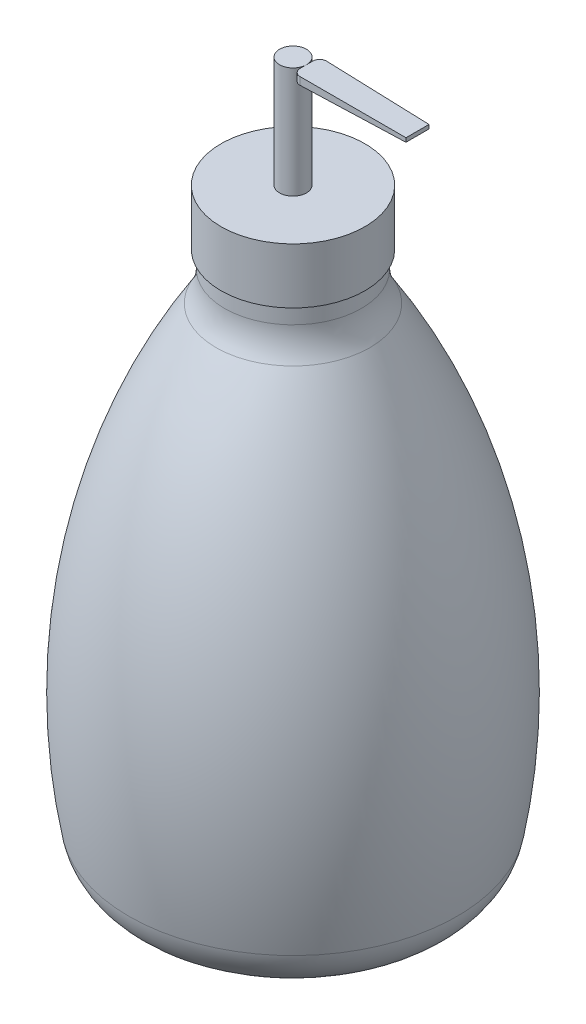
ISO-10303-21;
HEADER;
FILE_DESCRIPTION(('STEP AP214'),'2;1');
FILE_NAME('part.step','',(''),(''),'','','');
FILE_SCHEMA(('AUTOMOTIVE_DESIGN { 1 0 10303 214 1 1 1 1 }'));
ENDSEC;
DATA;
#1=APPLICATION_CONTEXT('core data for automotive mechanical design processes');
#2=APPLICATION_PROTOCOL_DEFINITION('international standard','automotive_design',2000,#1);
#3=PRODUCT_CONTEXT('',#1,'mechanical');
#4=PRODUCT('Part','Part','',(#3));
#5=PRODUCT_RELATED_PRODUCT_CATEGORY('part','',(#4));
#6=PRODUCT_DEFINITION_FORMATION('','',#4);
#7=PRODUCT_DEFINITION_CONTEXT('part definition',#1,'design');
#8=PRODUCT_DEFINITION('design','',#6,#7);
#9=PRODUCT_DEFINITION_SHAPE('','',#8);
#10=(LENGTH_UNIT() NAMED_UNIT(*) SI_UNIT(.MILLI.,.METRE.));
#11=(NAMED_UNIT(*) PLANE_ANGLE_UNIT() SI_UNIT($,.RADIAN.));
#12=(NAMED_UNIT(*) SI_UNIT($,.STERADIAN.) SOLID_ANGLE_UNIT());
#13=UNCERTAINTY_MEASURE_WITH_UNIT(LENGTH_MEASURE(1.E-05),#10,'distance_accuracy_value','');
#14=(GEOMETRIC_REPRESENTATION_CONTEXT(3) GLOBAL_UNCERTAINTY_ASSIGNED_CONTEXT((#13)) GLOBAL_UNIT_ASSIGNED_CONTEXT((#10,
#11,#12)) REPRESENTATION_CONTEXT('',''));
#15=CARTESIAN_POINT('',(0.,0.,0.));
#16=DIRECTION('',(0.,0.,1.));
#17=DIRECTION('',(1.,0.,0.));
#18=AXIS2_PLACEMENT_3D('',#15,#16,#17);
#19=CARTESIAN_POINT('',(2.46084864077986,86.0805582922824,2.46084864077986));
#20=DIRECTION('',(0.0174524064372835,0.,0.999847695156391));
#21=DIRECTION('',(0.999847695156391,0.,-0.0174524064372836));
#22=AXIS2_PLACEMENT_3D('',#19,#20,#21);
#23=PLANE('',#22);
#24=DIRECTION('',(-0.999695459881888,0.0174497491606827,0.0174497491606827));
#25=VECTOR('',#24,1.);
#26=CARTESIAN_POINT('',(2.46084864077986,86.0805582922824,2.46084864077986));
#27=LINE('',#26,#25);
#28=CARTESIAN_POINT('',(22.7808486407799,85.725871372941,2.10616172143848));
#29=VERTEX_POINT('',#28);
#30=CARTESIAN_POINT('',(3.75301319695521,86.0580034760564,2.43829382455388));
#31=VERTEX_POINT('',#30);
#32=EDGE_CURVE('E136',#29,#31,#27,.T.);
#33=ORIENTED_EDGE('',*,*,#32,.T.);
#34=DIRECTION('',(0.,-1.,0.));
#35=VECTOR('',#34,1.);
#36=CARTESIAN_POINT('',(3.75301319695521,86.0805582922824,2.43829382455388));
#37=LINE('',#36,#35);
#38=CARTESIAN_POINT('',(3.75301319695521,84.6696566749118,2.43829382455388));
#39=VERTEX_POINT('',#38);
#40=EDGE_CURVE('E12',#31,#39,#37,.T.);
#41=ORIENTED_EDGE('',*,*,#40,.T.);
#42=DIRECTION('',(-0.999695459881888,-0.0174497491606827,0.0174497491606827));
#43=VECTOR('',#42,1.);
#44=CARTESIAN_POINT('',(2.46084864077986,84.6471018586858,2.46084864077986));
#45=LINE('',#44,#43);
#46=CARTESIAN_POINT('',(22.7808486407799,85.0017887780272,2.10616172143848));
#47=VERTEX_POINT('',#46);
#48=EDGE_CURVE('E109',#47,#39,#45,.T.);
#49=ORIENTED_EDGE('',*,*,#48,.F.);
#50=DIRECTION('',(0.,1.,0.));
#51=VECTOR('',#50,1.);
#52=CARTESIAN_POINT('',(22.7808486407799,86.0805582922824,2.10616172143848));
#53=LINE('',#52,#51);
#54=EDGE_CURVE('E115',#29,#47,#53,.F.);
#55=ORIENTED_EDGE('',*,*,#54,.F.);
#56=EDGE_LOOP('',(#33,#41,#49,#55));
#57=FACE_BOUND('',#56,.T.);
#58=ADVANCED_FACE('F50',(#57),#23,.T.);
#59=CARTESIAN_POINT('',(2.46084864077986,84.6471018586858,2.46084864077986));
#60=DIRECTION('',(0.0174524064372835,-0.999847695156391,0.));
#61=DIRECTION('',(0.999847695156391,0.0174524064372835,0.));
#62=AXIS2_PLACEMENT_3D('',#59,#60,#61);
#63=PLANE('',#62);
#64=DIRECTION('',(0.,0.,-1.));
#65=VECTOR('',#64,1.);
#66=CARTESIAN_POINT('',(2.46084864077986,84.6471018586858,2.46084864077986));
#67=LINE('',#66,#65);
#68=CARTESIAN_POINT('',(2.46084864077986,84.6471018586858,1.16848725170526));
#69=VERTEX_POINT('',#68);
#70=CARTESIAN_POINT('',(2.46084864077986,84.6471018586858,-1.16848725170526));
#71=VERTEX_POINT('',#70);
#72=EDGE_CURVE('E149',#69,#71,#67,.T.);
#73=ORIENTED_EDGE('',*,*,#72,.T.);
#74=CARTESIAN_POINT('',(3.73084864077986,84.6692697911447,-1.16848725170526));
#75=DIRECTION('',(0.0174524064372835,-0.999847695156391,0.));
#76=DIRECTION('',(-0.999847695156391,-0.0174524064372835,0.));
#77=AXIS2_PLACEMENT_3D('',#74,#75,#76);
#78=ELLIPSE('',#77,1.27019345661576,1.27);
#79=CARTESIAN_POINT('',(3.75301319695521,84.6696566749118,-2.43829382455388));
#80=VERTEX_POINT('',#79);
#81=EDGE_CURVE('E58',#71,#80,#78,.T.);
#82=ORIENTED_EDGE('',*,*,#81,.T.);
#83=DIRECTION('',(-0.999695459881888,-0.0174497491606827,-0.0174497491606827));
#84=VECTOR('',#83,1.);
#85=CARTESIAN_POINT('',(2.48585447837829,84.6475383372047,-2.460412162261));
#86=LINE('',#85,#84);
#87=CARTESIAN_POINT('',(22.7808486407799,85.0017887780272,-2.10616172143848));
#88=VERTEX_POINT('',#87);
#89=EDGE_CURVE('E111',#88,#80,#86,.T.);
#90=ORIENTED_EDGE('',*,*,#89,.F.);
#91=DIRECTION('',(0.,0.,1.));
#92=VECTOR('',#91,1.);
#93=CARTESIAN_POINT('',(22.7808486407799,85.0017887780272,2.46084864077986));
#94=LINE('',#93,#92);
#95=EDGE_CURVE('E105',#47,#88,#94,.F.);
#96=ORIENTED_EDGE('',*,*,#95,.F.);
#97=ORIENTED_EDGE('',*,*,#48,.T.);
#98=CARTESIAN_POINT('',(3.73084864077986,84.6692697911447,1.16848725170526));
#99=DIRECTION('',(0.0174524064372835,-0.999847695156391,0.));
#100=DIRECTION('',(0.999847695156391,0.0174524064372835,0.));
#101=AXIS2_PLACEMENT_3D('',#98,#99,#100);
#102=ELLIPSE('',#101,1.27019345661576,1.27);
#103=EDGE_CURVE('E65',#39,#69,#102,.T.);
#104=ORIENTED_EDGE('',*,*,#103,.T.);
#105=EDGE_LOOP('',(#73,#82,#90,#96,#97,#104));
#106=FACE_BOUND('',#105,.T.);
#107=ADVANCED_FACE('F107',(#106),#63,.T.);
#108=CARTESIAN_POINT('',(2.46084864077986,86.0805582922824,-2.46084864077986));
#109=DIRECTION('',(0.0174524064372835,0.,-0.999847695156391));
#110=DIRECTION('',(-0.999847695156391,0.,-0.0174524064372836));
#111=AXIS2_PLACEMENT_3D('',#108,#109,#110);
#112=PLANE('',#111);
#113=ORIENTED_EDGE('',*,*,#89,.T.);
#114=DIRECTION('',(0.,1.,0.));
#115=VECTOR('',#114,1.);
#116=CARTESIAN_POINT('',(3.75301319695521,86.0805582922824,-2.43829382455388));
#117=LINE('',#116,#115);
#118=CARTESIAN_POINT('',(3.75301319695521,86.0580034760565,-2.43829382455388));
#119=VERTEX_POINT('',#118);
#120=EDGE_CURVE('E126',#80,#119,#117,.T.);
#121=ORIENTED_EDGE('',*,*,#120,.T.);
#122=DIRECTION('',(-0.999695459881888,0.0174497491606827,-0.0174497491606827));
#123=VECTOR('',#122,1.);
#124=CARTESIAN_POINT('',(2.54670486915683,86.0790596662416,-2.45935001473905));
#125=LINE('',#124,#123);
#126=CARTESIAN_POINT('',(22.7808486407799,85.725871372941,-2.10616172143848));
#127=VERTEX_POINT('',#126);
#128=EDGE_CURVE('E131',#127,#119,#125,.T.);
#129=ORIENTED_EDGE('',*,*,#128,.F.);
#130=DIRECTION('',(0.,-1.,0.));
#131=VECTOR('',#130,1.);
#132=CARTESIAN_POINT('',(22.7808486407799,86.0805582922824,-2.10616172143848));
#133=LINE('',#132,#131);
#134=EDGE_CURVE('E114',#88,#127,#133,.F.);
#135=ORIENTED_EDGE('',*,*,#134,.F.);
#136=EDGE_LOOP('',(#113,#121,#129,#135));
#137=FACE_BOUND('',#136,.T.);
#138=ADVANCED_FACE('F153',(#137),#112,.T.);
#139=CARTESIAN_POINT('',(2.46084864077986,86.0805582922824,2.46084864077986));
#140=DIRECTION('',(0.0174524064372835,0.999847695156391,0.));
#141=DIRECTION('',(-0.999847695156391,0.0174524064372835,0.));
#142=AXIS2_PLACEMENT_3D('',#139,#140,#141);
#143=PLANE('',#142);
#144=ORIENTED_EDGE('',*,*,#128,.T.);
#145=CARTESIAN_POINT('',(3.73084864077986,86.0583903598236,-1.16848725170526));
#146=DIRECTION('',(0.0174524064372835,0.999847695156391,0.));
#147=DIRECTION('',(0.999847695156391,-0.0174524064372835,0.));
#148=AXIS2_PLACEMENT_3D('',#145,#146,#147);
#149=ELLIPSE('',#148,1.27019345661576,1.27);
#150=CARTESIAN_POINT('',(2.46084864077986,86.0805582922824,-1.16848725170526));
#151=VERTEX_POINT('',#150);
#152=EDGE_CURVE('E143',#119,#151,#149,.T.);
#153=ORIENTED_EDGE('',*,*,#152,.T.);
#154=DIRECTION('',(0.,0.,1.));
#155=VECTOR('',#154,1.);
#156=CARTESIAN_POINT('',(2.46084864077986,86.0805582922824,2.46084864077986));
#157=LINE('',#156,#155);
#158=CARTESIAN_POINT('',(2.46084864077986,86.0805582922824,1.16848725170526));
#159=VERTEX_POINT('',#158);
#160=EDGE_CURVE('E124',#151,#159,#157,.T.);
#161=ORIENTED_EDGE('',*,*,#160,.T.);
#162=CARTESIAN_POINT('',(3.73084864077986,86.0583903598236,1.16848725170526));
#163=DIRECTION('',(0.0174524064372835,0.999847695156391,0.));
#164=DIRECTION('',(-0.999847695156391,0.0174524064372835,0.));
#165=AXIS2_PLACEMENT_3D('',#162,#163,#164);
#166=ELLIPSE('',#165,1.27019345661576,1.27);
#167=EDGE_CURVE('E129',#159,#31,#166,.T.);
#168=ORIENTED_EDGE('',*,*,#167,.T.);
#169=ORIENTED_EDGE('',*,*,#32,.F.);
#170=DIRECTION('',(0.,0.,-1.));
#171=VECTOR('',#170,1.);
#172=CARTESIAN_POINT('',(22.7808486407799,85.725871372941,2.46084864077986));
#173=LINE('',#172,#171);
#174=EDGE_CURVE('E120',#127,#29,#173,.F.);
#175=ORIENTED_EDGE('',*,*,#174,.F.);
#176=EDGE_LOOP('',(#144,#153,#161,#168,#169,#175));
#177=FACE_BOUND('',#176,.T.);
#178=ADVANCED_FACE('F158',(#177),#143,.T.);
#179=CARTESIAN_POINT('',(22.7808486407799,0.,0.));
#180=DIRECTION('',(1.,0.,0.));
#181=DIRECTION('',(0.,0.,-1.));
#182=AXIS2_PLACEMENT_3D('',#179,#180,#181);
#183=PLANE('',#182);
#184=ORIENTED_EDGE('',*,*,#54,.T.);
#185=ORIENTED_EDGE('',*,*,#95,.T.);
#186=ORIENTED_EDGE('',*,*,#134,.T.);
#187=ORIENTED_EDGE('',*,*,#174,.T.);
#188=EDGE_LOOP('',(#184,#185,#186,#187));
#189=FACE_BOUND('',#188,.T.);
#190=ADVANCED_FACE('F118',(#189),#183,.T.);
#191=CARTESIAN_POINT('',(2.46084864077986,0.,0.));
#192=DIRECTION('',(1.,0.,0.));
#193=DIRECTION('',(0.,0.,-1.));
#194=AXIS2_PLACEMENT_3D('',#191,#192,#193);
#195=PLANE('',#194);
#196=ORIENTED_EDGE('',*,*,#160,.F.);
#197=DIRECTION('',(0.,-1.,0.));
#198=VECTOR('',#197,1.);
#199=CARTESIAN_POINT('',(2.46084864077986,0.,-1.16848725170526));
#200=LINE('',#199,#198);
#201=EDGE_CURVE('E72',#151,#71,#200,.T.);
#202=ORIENTED_EDGE('',*,*,#201,.T.);
#203=ORIENTED_EDGE('',*,*,#72,.F.);
#204=DIRECTION('',(0.,1.,0.));
#205=VECTOR('',#204,1.);
#206=CARTESIAN_POINT('',(2.46084864077986,0.,1.16848725170526));
#207=LINE('',#206,#205);
#208=EDGE_CURVE('E145',#69,#159,#207,.T.);
#209=ORIENTED_EDGE('',*,*,#208,.T.);
#210=EDGE_LOOP('',(#196,#202,#203,#209));
#211=FACE_BOUND('',#210,.T.);
#212=ADVANCED_FACE('F160',(#211),#195,.F.);
#213=CARTESIAN_POINT('',(3.73084864077986,86.0805582922824,-1.16848725170526));
#214=DIRECTION('',(0.,-1.,0.));
#215=DIRECTION('',(0.,0.,-1.));
#216=AXIS2_PLACEMENT_3D('',#213,#214,#215);
#217=CYLINDRICAL_SURFACE('',#216,1.27);
#218=ORIENTED_EDGE('',*,*,#81,.F.);
#219=ORIENTED_EDGE('',*,*,#201,.F.);
#220=ORIENTED_EDGE('',*,*,#152,.F.);
#221=ORIENTED_EDGE('',*,*,#120,.F.);
#222=EDGE_LOOP('',(#218,#219,#220,#221));
#223=FACE_BOUND('',#222,.T.);
#224=ADVANCED_FACE('F155',(#223),#217,.T.);
#225=CARTESIAN_POINT('',(3.73084864077986,86.0805582922824,1.16848725170526));
#226=DIRECTION('',(0.,1.,0.));
#227=DIRECTION('',(0.,0.,1.));
#228=AXIS2_PLACEMENT_3D('',#225,#226,#227);
#229=CYLINDRICAL_SURFACE('',#228,1.27);
#230=ORIENTED_EDGE('',*,*,#167,.F.);
#231=ORIENTED_EDGE('',*,*,#208,.F.);
#232=ORIENTED_EDGE('',*,*,#103,.F.);
#233=ORIENTED_EDGE('',*,*,#40,.F.);
#234=EDGE_LOOP('',(#230,#231,#232,#233));
#235=FACE_BOUND('',#234,.T.);
#236=ADVANCED_FACE('F52',(#235),#229,.T.);
#237=CLOSED_SHELL('',(#58,#107,#138,#178,#190,#212,#224,#236));
#238=MANIFOLD_SOLID_BREP('B2',#237);
#239=CARTESIAN_POINT('',(0.,55.6005582922824,0.));
#240=DIRECTION('',(0.,1.,0.));
#241=DIRECTION('',(0.,0.,1.));
#242=AXIS2_PLACEMENT_3D('',#239,#240,#241);
#243=CYLINDRICAL_SURFACE('',#242,13.1649431338823);
#244=CARTESIAN_POINT('',(0.,55.6005582922824,0.));
#245=DIRECTION('',(0.,1.,0.));
#246=DIRECTION('',(0.,0.,1.));
#247=AXIS2_PLACEMENT_3D('',#244,#245,#246);
#248=CIRCLE('',#247,13.1649431338823);
#249=CARTESIAN_POINT('',(0.,55.6005582922824,13.1649431338823));
#250=VERTEX_POINT('',#249);
#251=EDGE_CURVE('E236',#250,#250,#248,.T.);
#252=ORIENTED_EDGE('',*,*,#251,.T.);
#253=EDGE_LOOP('',(#252));
#254=FACE_BOUND('',#253,.T.);
#255=CARTESIAN_POINT('',(0.,65.7605582922824,0.));
#256=DIRECTION('',(0.,1.,0.));
#257=DIRECTION('',(0.,0.,1.));
#258=AXIS2_PLACEMENT_3D('',#255,#256,#257);
#259=CIRCLE('',#258,13.1649431338823);
#260=CARTESIAN_POINT('',(0.,65.7605582922824,13.1649431338823));
#261=VERTEX_POINT('',#260);
#262=EDGE_CURVE('E244',#261,#261,#259,.T.);
#263=ORIENTED_EDGE('',*,*,#262,.F.);
#264=EDGE_LOOP('',(#263));
#265=FACE_BOUND('',#264,.T.);
#266=ADVANCED_FACE('F233',(#254,#265),#243,.T.);
#267=CARTESIAN_POINT('',(0.,55.6005582922824,0.));
#268=DIRECTION('',(0.,1.,0.));
#269=DIRECTION('',(0.,0.,1.));
#270=AXIS2_PLACEMENT_3D('',#267,#268,#269);
#271=PLANE('',#270);
#272=ORIENTED_EDGE('',*,*,#251,.F.);
#273=EDGE_LOOP('',(#272));
#274=FACE_BOUND('',#273,.T.);
#275=ADVANCED_FACE('F264',(#274),#271,.F.);
#276=CARTESIAN_POINT('',(0.,65.7605582922824,0.));
#277=DIRECTION('',(0.,1.,0.));
#278=DIRECTION('',(0.,0.,1.));
#279=AXIS2_PLACEMENT_3D('',#276,#277,#278);
#280=PLANE('',#279);
#281=CARTESIAN_POINT('',(0.,65.7605582922824,0.));
#282=DIRECTION('',(0.,1.,0.));
#283=DIRECTION('',(0.,0.,1.));
#284=AXIS2_PLACEMENT_3D('',#281,#282,#283);
#285=CIRCLE('',#284,2.46084864077986);
#286=CARTESIAN_POINT('',(0.,65.7605582922824,2.46084864077986));
#287=VERTEX_POINT('',#286);
#288=EDGE_CURVE('E49',#287,#287,#285,.T.);
#289=ORIENTED_EDGE('',*,*,#288,.F.);
#290=EDGE_LOOP('',(#289));
#291=FACE_BOUND('',#290,.T.);
#292=ORIENTED_EDGE('',*,*,#262,.T.);
#293=EDGE_LOOP('',(#292));
#294=FACE_BOUND('',#293,.T.);
#295=ADVANCED_FACE('F257',(#291,#294),#280,.T.);
#296=CARTESIAN_POINT('',(0.,86.0805582922824,0.));
#297=DIRECTION('',(0.,-1.,0.));
#298=DIRECTION('',(0.,0.,-1.));
#299=AXIS2_PLACEMENT_3D('',#296,#297,#298);
#300=CYLINDRICAL_SURFACE('',#299,2.46084864077986);
#301=CARTESIAN_POINT('',(0.,86.0805582922824,0.));
#302=DIRECTION('',(0.,1.,0.));
#303=DIRECTION('',(0.,0.,1.));
#304=AXIS2_PLACEMENT_3D('',#301,#302,#303);
#305=CIRCLE('',#304,2.46084864077986);
#306=CARTESIAN_POINT('',(0.,86.0805582922824,2.46084864077986));
#307=VERTEX_POINT('',#306);
#308=EDGE_CURVE('E246',#307,#307,#305,.T.);
#309=ORIENTED_EDGE('',*,*,#308,.F.);
#310=EDGE_LOOP('',(#309));
#311=FACE_BOUND('',#310,.T.);
#312=ORIENTED_EDGE('',*,*,#288,.T.);
#313=EDGE_LOOP('',(#312));
#314=FACE_BOUND('',#313,.T.);
#315=ADVANCED_FACE('F255',(#311,#314),#300,.T.);
#316=CARTESIAN_POINT('',(0.,86.0805582922824,0.));
#317=DIRECTION('',(0.,1.,0.));
#318=DIRECTION('',(0.,0.,1.));
#319=AXIS2_PLACEMENT_3D('',#316,#317,#318);
#320=PLANE('',#319);
#321=ORIENTED_EDGE('',*,*,#308,.T.);
#322=EDGE_LOOP('',(#321));
#323=FACE_BOUND('',#322,.T.);
#324=ADVANCED_FACE('F253',(#323),#320,.T.);
#325=CLOSED_SHELL('',(#266,#275,#295,#315,#324));
#326=MANIFOLD_SOLID_BREP('B6',#325);
#327=CARTESIAN_POINT('',(0.,58.1405582922824,0.));
#328=DIRECTION('',(0.,1.,0.));
#329=DIRECTION('',(0.,0.,1.));
#330=AXIS2_PLACEMENT_3D('',#327,#328,#329);
#331=PLANE('',#330);
#332=CARTESIAN_POINT('',(0.,58.1405582922824,0.));
#333=DIRECTION('',(0.,1.,0.));
#334=DIRECTION('',(0.,0.,1.));
#335=AXIS2_PLACEMENT_3D('',#332,#333,#334);
#336=CIRCLE('',#335,12.512315270936);
#337=CARTESIAN_POINT('',(0.,58.1405582922824,12.512315270936));
#338=VERTEX_POINT('',#337);
#339=EDGE_CURVE('E324',#338,#338,#336,.T.);
#340=ORIENTED_EDGE('',*,*,#339,.T.);
#341=EDGE_LOOP('',(#340));
#342=FACE_BOUND('',#341,.T.);
#343=ADVANCED_FACE('F300',(#342),#331,.T.);
#344=CARTESIAN_POINT('',(0.,58.1405582922824,0.));
#345=DIRECTION('',(0.,1.,0.));
#346=DIRECTION('',(0.,0.,1.));
#347=AXIS2_PLACEMENT_3D('',#344,#345,#346);
#348=CYLINDRICAL_SURFACE('',#347,12.512315270936);
#349=CARTESIAN_POINT('',(0.,52.4699104241922,0.));
#350=DIRECTION('',(0.,1.,0.));
#351=DIRECTION('',(0.,0.,1.));
#352=AXIS2_PLACEMENT_3D('',#349,#350,#351);
#353=CIRCLE('',#352,12.512315270936);
#354=CARTESIAN_POINT('',(0.,52.4699104241922,12.512315270936));
#355=VERTEX_POINT('',#354);
#356=EDGE_CURVE('E318',#355,#355,#353,.T.);
#357=ORIENTED_EDGE('',*,*,#356,.T.);
#358=EDGE_LOOP('',(#357));
#359=FACE_BOUND('',#358,.T.);
#360=ORIENTED_EDGE('',*,*,#339,.F.);
#361=EDGE_LOOP('',(#360));
#362=FACE_BOUND('',#361,.T.);
#363=ADVANCED_FACE('F330',(#359,#362),#348,.T.);
#364=CARTESIAN_POINT('',(0.,-14.5262811221773,0.));
#365=DIRECTION('',(0.,1.,0.));
#366=DIRECTION('',(0.,0.,1.));
#367=AXIS2_PLACEMENT_3D('',#364,#365,#366);
#368=DEGENERATE_TOROIDAL_SURFACE('',#367,83.5166858522366,115.397132976406,.F.);
#369=CARTESIAN_POINT('',(0.,47.0486229992952,0.));
#370=DIRECTION('',(0.,-1.,0.));
#371=DIRECTION('',(0.,0.,-1.));
#372=AXIS2_PLACEMENT_3D('',#369,#370,#371);
#373=CIRCLE('',#372,14.0795716662045);
#374=CARTESIAN_POINT('',(0.,47.0486229992952,-14.0795716662045));
#375=VERTEX_POINT('',#374);
#376=EDGE_CURVE('E308',#375,#375,#373,.T.);
#377=ORIENTED_EDGE('',*,*,#376,.T.);
#378=EDGE_LOOP('',(#377));
#379=FACE_BOUND('',#378,.T.);
#380=CARTESIAN_POINT('',(0.,-35.11187526757,0.));
#381=DIRECTION('',(0.,1.,0.));
#382=DIRECTION('',(0.,0.,1.));
#383=AXIS2_PLACEMENT_3D('',#380,#381,#382);
#384=CIRCLE('',#383,30.0294792651093);
#385=CARTESIAN_POINT('',(0.,-35.11187526757,30.0294792651093));
#386=VERTEX_POINT('',#385);
#387=EDGE_CURVE('E313',#386,#386,#384,.T.);
#388=ORIENTED_EDGE('',*,*,#387,.T.);
#389=EDGE_LOOP('',(#388));
#390=FACE_BOUND('',#389,.T.);
#391=ADVANCED_FACE('F332',(#379,#390),#368,.F.);
#392=CARTESIAN_POINT('',(0.,-43.4594417077176,0.));
#393=DIRECTION('',(0.,-1.,0.));
#394=DIRECTION('',(0.,0.,-1.));
#395=AXIS2_PLACEMENT_3D('',#392,#393,#394);
#396=PLANE('',#395);
#397=CARTESIAN_POINT('',(0.,-43.4594417077176,0.));
#398=DIRECTION('',(0.,-1.,0.));
#399=DIRECTION('',(0.,0.,-1.));
#400=AXIS2_PLACEMENT_3D('',#397,#398,#399);
#401=CIRCLE('',#400,20.0324454754735);
#402=CARTESIAN_POINT('',(0.,-43.4594417077176,-20.0324454754735));
#403=VERTEX_POINT('',#402);
#404=EDGE_CURVE('E232',#403,#403,#401,.T.);
#405=ORIENTED_EDGE('',*,*,#404,.T.);
#406=EDGE_LOOP('',(#405));
#407=FACE_BOUND('',#406,.T.);
#408=ADVANCED_FACE('F339',(#407),#396,.T.);
#409=CARTESIAN_POINT('',(0.,52.4699104241922,0.));
#410=DIRECTION('',(0.,1.,0.));
#411=DIRECTION('',(0.,0.,1.));
#412=AXIS2_PLACEMENT_3D('',#409,#410,#411);
#413=TOROIDAL_SURFACE('',#412,22.672315270936,10.16);
#414=ORIENTED_EDGE('',*,*,#376,.F.);
#415=EDGE_LOOP('',(#414));
#416=FACE_BOUND('',#415,.T.);
#417=ORIENTED_EDGE('',*,*,#356,.F.);
#418=EDGE_LOOP('',(#417));
#419=FACE_BOUND('',#418,.T.);
#420=ADVANCED_FACE('F343',(#416,#419),#413,.F.);
#421=CARTESIAN_POINT('',(0.,-33.2994417077176,0.));
#422=DIRECTION('',(0.,-1.,0.));
#423=DIRECTION('',(0.,0.,-1.));
#424=AXIS2_PLACEMENT_3D('',#421,#422,#423);
#425=TOROIDAL_SURFACE('',#424,20.0324454754735,10.16);
#426=ORIENTED_EDGE('',*,*,#404,.F.);
#427=EDGE_LOOP('',(#426));
#428=FACE_BOUND('',#427,.T.);
#429=ORIENTED_EDGE('',*,*,#387,.F.);
#430=EDGE_LOOP('',(#429));
#431=FACE_BOUND('',#430,.T.);
#432=ADVANCED_FACE('F302',(#428,#431),#425,.T.);
#433=CLOSED_SHELL('',(#343,#363,#391,#408,#420,#432));
#434=MANIFOLD_SOLID_BREP('B44',#433);
#435=ADVANCED_BREP_SHAPE_REPRESENTATION('',(#18,#238,#326,#434),#14);
#436=SHAPE_DEFINITION_REPRESENTATION(#9,#435);
ENDSEC;
END-ISO-10303-21;
